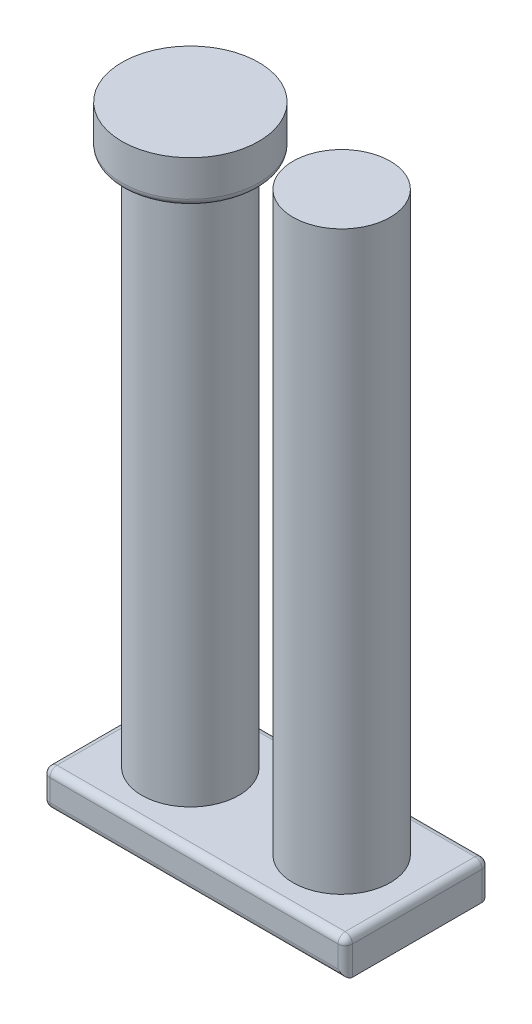
ISO-10303-21;
HEADER;
FILE_DESCRIPTION(('STEP AP214'),'2;1');
FILE_NAME('part.step','',(''),(''),'','','');
FILE_SCHEMA(('AUTOMOTIVE_DESIGN { 1 0 10303 214 1 1 1 1 }'));
ENDSEC;
DATA;
#1=APPLICATION_CONTEXT('core data for automotive mechanical design processes');
#2=APPLICATION_PROTOCOL_DEFINITION('international standard','automotive_design',2000,#1);
#3=PRODUCT_CONTEXT('',#1,'mechanical');
#4=PRODUCT('Part','Part','',(#3));
#5=PRODUCT_RELATED_PRODUCT_CATEGORY('part','',(#4));
#6=PRODUCT_DEFINITION_FORMATION('','',#4);
#7=PRODUCT_DEFINITION_CONTEXT('part definition',#1,'design');
#8=PRODUCT_DEFINITION('design','',#6,#7);
#9=PRODUCT_DEFINITION_SHAPE('','',#8);
#10=(LENGTH_UNIT() NAMED_UNIT(*) SI_UNIT(.MILLI.,.METRE.));
#11=(NAMED_UNIT(*) PLANE_ANGLE_UNIT() SI_UNIT($,.RADIAN.));
#12=(NAMED_UNIT(*) SI_UNIT($,.STERADIAN.) SOLID_ANGLE_UNIT());
#13=UNCERTAINTY_MEASURE_WITH_UNIT(LENGTH_MEASURE(1.E-05),#10,'distance_accuracy_value','');
#14=(GEOMETRIC_REPRESENTATION_CONTEXT(3) GLOBAL_UNCERTAINTY_ASSIGNED_CONTEXT((#13)) GLOBAL_UNIT_ASSIGNED_CONTEXT((#10,
#11,#12)) REPRESENTATION_CONTEXT('',''));
#15=CARTESIAN_POINT('',(0.,0.,0.));
#16=DIRECTION('',(0.,0.,1.));
#17=DIRECTION('',(1.,0.,0.));
#18=AXIS2_PLACEMENT_3D('',#15,#16,#17);
#19=CARTESIAN_POINT('',(-10.5,85.,0.));
#20=DIRECTION('',(0.,-1.,0.));
#21=DIRECTION('',(0.,0.,-1.));
#22=AXIS2_PLACEMENT_3D('',#19,#20,#21);
#23=CYLINDRICAL_SURFACE('',#22,6.75);
#24=CARTESIAN_POINT('',(-10.5,78.,0.));
#25=DIRECTION('',(0.,1.,0.));
#26=DIRECTION('',(0.,0.,1.));
#27=AXIS2_PLACEMENT_3D('',#24,#25,#26);
#28=CIRCLE('',#27,6.75);
#29=CARTESIAN_POINT('',(-10.5,78.,6.75));
#30=VERTEX_POINT('',#29);
#31=EDGE_CURVE('E11',#30,#30,#28,.F.);
#32=ORIENTED_EDGE('',*,*,#31,.T.);
#33=EDGE_LOOP('',(#32));
#34=FACE_BOUND('',#33,.T.);
#35=CARTESIAN_POINT('',(-10.5,5.,0.));
#36=DIRECTION('',(0.,1.,0.));
#37=DIRECTION('',(0.,0.,1.));
#38=AXIS2_PLACEMENT_3D('',#35,#36,#37);
#39=CIRCLE('',#38,6.75);
#40=CARTESIAN_POINT('',(-10.5,5.,6.75));
#41=VERTEX_POINT('',#40);
#42=EDGE_CURVE('E222',#41,#41,#39,.F.);
#43=ORIENTED_EDGE('',*,*,#42,.F.);
#44=EDGE_LOOP('',(#43));
#45=FACE_BOUND('',#44,.T.);
#46=ADVANCED_FACE('F39',(#34,#45),#23,.T.);
#47=CARTESIAN_POINT('',(21.,5.,0.));
#48=DIRECTION('',(1.,0.,0.));
#49=DIRECTION('',(0.,0.,-1.));
#50=AXIS2_PLACEMENT_3D('',#47,#48,#49);
#51=PLANE('',#50);
#52=DIRECTION('',(0.,0.,1.));
#53=VECTOR('',#52,1.);
#54=CARTESIAN_POINT('',(21.,0.,0.));
#55=LINE('',#54,#53);
#56=CARTESIAN_POINT('',(21.,0.,-9.));
#57=VERTEX_POINT('',#56);
#58=CARTESIAN_POINT('',(21.,0.,9.00000000000001));
#59=VERTEX_POINT('',#58);
#60=EDGE_CURVE('E146',#57,#59,#55,.T.);
#61=ORIENTED_EDGE('',*,*,#60,.F.);
#62=DIRECTION('',(0.,-1.,0.));
#63=VECTOR('',#62,1.);
#64=CARTESIAN_POINT('',(21.,5.,-9.));
#65=LINE('',#64,#63);
#66=CARTESIAN_POINT('',(21.,4.,-9.));
#67=VERTEX_POINT('',#66);
#68=EDGE_CURVE('E233',#57,#67,#65,.F.);
#69=ORIENTED_EDGE('',*,*,#68,.T.);
#70=DIRECTION('',(0.,0.,1.));
#71=VECTOR('',#70,1.);
#72=CARTESIAN_POINT('',(21.,4.,0.));
#73=LINE('',#72,#71);
#74=CARTESIAN_POINT('',(21.,4.,9.00000000000001));
#75=VERTEX_POINT('',#74);
#76=EDGE_CURVE('E229',#67,#75,#73,.T.);
#77=ORIENTED_EDGE('',*,*,#76,.T.);
#78=DIRECTION('',(0.,-1.,0.));
#79=VECTOR('',#78,1.);
#80=CARTESIAN_POINT('',(21.,0.,9.00000000000001));
#81=LINE('',#80,#79);
#82=EDGE_CURVE('E231',#75,#59,#81,.T.);
#83=ORIENTED_EDGE('',*,*,#82,.T.);
#84=EDGE_LOOP('',(#61,#69,#77,#83));
#85=FACE_BOUND('',#84,.T.);
#86=ADVANCED_FACE('F278',(#85),#51,.T.);
#87=CARTESIAN_POINT('',(0.,5.,-9.99999999999999));
#88=DIRECTION('',(0.,0.,-1.));
#89=DIRECTION('',(-1.,0.,0.));
#90=AXIS2_PLACEMENT_3D('',#87,#88,#89);
#91=PLANE('',#90);
#92=DIRECTION('',(1.,0.,0.));
#93=VECTOR('',#92,1.);
#94=CARTESIAN_POINT('',(0.,4.,-9.99999999999999));
#95=LINE('',#94,#93);
#96=CARTESIAN_POINT('',(-20.,4.,-9.99999999999999));
#97=VERTEX_POINT('',#96);
#98=CARTESIAN_POINT('',(20.,4.,-10.));
#99=VERTEX_POINT('',#98);
#100=EDGE_CURVE('E134',#97,#99,#95,.T.);
#101=ORIENTED_EDGE('',*,*,#100,.T.);
#102=DIRECTION('',(0.,-1.,0.));
#103=VECTOR('',#102,1.);
#104=CARTESIAN_POINT('',(20.,5.,-10.));
#105=LINE('',#104,#103);
#106=CARTESIAN_POINT('',(20.,1.,-10.));
#107=VERTEX_POINT('',#106);
#108=EDGE_CURVE('E130',#99,#107,#105,.T.);
#109=ORIENTED_EDGE('',*,*,#108,.T.);
#110=DIRECTION('',(1.,0.,0.));
#111=VECTOR('',#110,1.);
#112=CARTESIAN_POINT('',(-21.,1.,-9.99999999999999));
#113=LINE('',#112,#111);
#114=CARTESIAN_POINT('',(-20.,1.,-9.99999999999999));
#115=VERTEX_POINT('',#114);
#116=EDGE_CURVE('E124',#107,#115,#113,.F.);
#117=ORIENTED_EDGE('',*,*,#116,.T.);
#118=DIRECTION('',(0.,-1.,0.));
#119=VECTOR('',#118,1.);
#120=CARTESIAN_POINT('',(-20.,5.,-9.99999999999999));
#121=LINE('',#120,#119);
#122=EDGE_CURVE('E127',#115,#97,#121,.F.);
#123=ORIENTED_EDGE('',*,*,#122,.T.);
#124=EDGE_LOOP('',(#101,#109,#117,#123));
#125=FACE_BOUND('',#124,.T.);
#126=ADVANCED_FACE('F126',(#125),#91,.T.);
#127=CARTESIAN_POINT('',(-21.,5.,0.));
#128=DIRECTION('',(1.,0.,0.));
#129=DIRECTION('',(0.,0.,-1.));
#130=AXIS2_PLACEMENT_3D('',#127,#128,#129);
#131=PLANE('',#130);
#132=DIRECTION('',(0.,0.,1.));
#133=VECTOR('',#132,1.);
#134=CARTESIAN_POINT('',(-21.,4.,-9.99999999999999));
#135=LINE('',#134,#133);
#136=CARTESIAN_POINT('',(-21.,4.,9.00000000000001));
#137=VERTEX_POINT('',#136);
#138=CARTESIAN_POINT('',(-21.,4.,-8.99999999999999));
#139=VERTEX_POINT('',#138);
#140=EDGE_CURVE('E56',#137,#139,#135,.F.);
#141=ORIENTED_EDGE('',*,*,#140,.T.);
#142=DIRECTION('',(0.,-1.,0.));
#143=VECTOR('',#142,1.);
#144=CARTESIAN_POINT('',(-21.,0.,-8.99999999999999));
#145=LINE('',#144,#143);
#146=CARTESIAN_POINT('',(-21.,1.,-8.99999999999999));
#147=VERTEX_POINT('',#146);
#148=EDGE_CURVE('E263',#139,#147,#145,.T.);
#149=ORIENTED_EDGE('',*,*,#148,.T.);
#150=DIRECTION('',(0.,0.,1.));
#151=VECTOR('',#150,1.);
#152=CARTESIAN_POINT('',(-21.,1.,0.));
#153=LINE('',#152,#151);
#154=CARTESIAN_POINT('',(-21.,1.,9.00000000000001));
#155=VERTEX_POINT('',#154);
#156=EDGE_CURVE('E259',#147,#155,#153,.T.);
#157=ORIENTED_EDGE('',*,*,#156,.T.);
#158=DIRECTION('',(0.,-1.,0.));
#159=VECTOR('',#158,1.);
#160=CARTESIAN_POINT('',(-21.,5.,9.00000000000001));
#161=LINE('',#160,#159);
#162=EDGE_CURVE('E61',#155,#137,#161,.F.);
#163=ORIENTED_EDGE('',*,*,#162,.T.);
#164=EDGE_LOOP('',(#141,#149,#157,#163));
#165=FACE_BOUND('',#164,.T.);
#166=ADVANCED_FACE('F294',(#165),#131,.F.);
#167=CARTESIAN_POINT('',(0.,5.,10.));
#168=DIRECTION('',(0.,0.,-1.));
#169=DIRECTION('',(-1.,0.,0.));
#170=AXIS2_PLACEMENT_3D('',#167,#168,#169);
#171=PLANE('',#170);
#172=DIRECTION('',(1.,0.,0.));
#173=VECTOR('',#172,1.);
#174=CARTESIAN_POINT('',(0.,1.,10.));
#175=LINE('',#174,#173);
#176=CARTESIAN_POINT('',(-20.,1.,10.));
#177=VERTEX_POINT('',#176);
#178=CARTESIAN_POINT('',(20.,1.,10.));
#179=VERTEX_POINT('',#178);
#180=EDGE_CURVE('E245',#177,#179,#175,.T.);
#181=ORIENTED_EDGE('',*,*,#180,.T.);
#182=DIRECTION('',(0.,-1.,0.));
#183=VECTOR('',#182,1.);
#184=CARTESIAN_POINT('',(20.,5.,10.));
#185=LINE('',#184,#183);
#186=CARTESIAN_POINT('',(20.,4.,10.));
#187=VERTEX_POINT('',#186);
#188=EDGE_CURVE('E247',#179,#187,#185,.F.);
#189=ORIENTED_EDGE('',*,*,#188,.T.);
#190=DIRECTION('',(1.,0.,0.));
#191=VECTOR('',#190,1.);
#192=CARTESIAN_POINT('',(-21.,4.,10.));
#193=LINE('',#192,#191);
#194=CARTESIAN_POINT('',(-20.,4.,10.));
#195=VERTEX_POINT('',#194);
#196=EDGE_CURVE('E243',#187,#195,#193,.F.);
#197=ORIENTED_EDGE('',*,*,#196,.T.);
#198=DIRECTION('',(0.,-1.,0.));
#199=VECTOR('',#198,1.);
#200=CARTESIAN_POINT('',(-20.,5.,10.));
#201=LINE('',#200,#199);
#202=EDGE_CURVE('E241',#195,#177,#201,.T.);
#203=ORIENTED_EDGE('',*,*,#202,.T.);
#204=EDGE_LOOP('',(#181,#189,#197,#203));
#205=FACE_BOUND('',#204,.T.);
#206=ADVANCED_FACE('F296',(#205),#171,.F.);
#207=CARTESIAN_POINT('',(0.,5.,0.));
#208=DIRECTION('',(0.,1.,0.));
#209=DIRECTION('',(0.,0.,1.));
#210=AXIS2_PLACEMENT_3D('',#207,#208,#209);
#211=PLANE('',#210);
#212=DIRECTION('',(1.,0.,0.));
#213=VECTOR('',#212,1.);
#214=CARTESIAN_POINT('',(21.,5.,9.00000000000001));
#215=LINE('',#214,#213);
#216=CARTESIAN_POINT('',(-20.,5.,9.00000000000001));
#217=VERTEX_POINT('',#216);
#218=CARTESIAN_POINT('',(20.,5.,9.00000000000001));
#219=VERTEX_POINT('',#218);
#220=EDGE_CURVE('E254',#217,#219,#215,.T.);
#221=ORIENTED_EDGE('',*,*,#220,.T.);
#222=DIRECTION('',(0.,0.,1.));
#223=VECTOR('',#222,1.);
#224=CARTESIAN_POINT('',(20.,5.,0.));
#225=LINE('',#224,#223);
#226=CARTESIAN_POINT('',(20.,5.,-9.));
#227=VERTEX_POINT('',#226);
#228=EDGE_CURVE('E257',#219,#227,#225,.F.);
#229=ORIENTED_EDGE('',*,*,#228,.T.);
#230=DIRECTION('',(1.,0.,0.));
#231=VECTOR('',#230,1.);
#232=CARTESIAN_POINT('',(0.,5.,-8.99999999999999));
#233=LINE('',#232,#231);
#234=CARTESIAN_POINT('',(-20.,5.,-8.99999999999999));
#235=VERTEX_POINT('',#234);
#236=EDGE_CURVE('E252',#227,#235,#233,.F.);
#237=ORIENTED_EDGE('',*,*,#236,.T.);
#238=DIRECTION('',(0.,0.,1.));
#239=VECTOR('',#238,1.);
#240=CARTESIAN_POINT('',(-20.,5.,10.));
#241=LINE('',#240,#239);
#242=EDGE_CURVE('E250',#235,#217,#241,.T.);
#243=ORIENTED_EDGE('',*,*,#242,.T.);
#244=EDGE_LOOP('',(#221,#229,#237,#243));
#245=FACE_BOUND('',#244,.T.);
#246=CARTESIAN_POINT('',(10.5,5.,0.));
#247=DIRECTION('',(0.,1.,0.));
#248=DIRECTION('',(0.,0.,1.));
#249=AXIS2_PLACEMENT_3D('',#246,#247,#248);
#250=CIRCLE('',#249,6.75);
#251=CARTESIAN_POINT('',(10.5,5.,6.75));
#252=VERTEX_POINT('',#251);
#253=EDGE_CURVE('E217',#252,#252,#250,.F.);
#254=ORIENTED_EDGE('',*,*,#253,.T.);
#255=EDGE_LOOP('',(#254));
#256=FACE_BOUND('',#255,.T.);
#257=ORIENTED_EDGE('',*,*,#42,.T.);
#258=EDGE_LOOP('',(#257));
#259=FACE_BOUND('',#258,.T.);
#260=ADVANCED_FACE('F302',(#245,#256,#259),#211,.T.);
#261=CARTESIAN_POINT('',(0.,0.,0.));
#262=DIRECTION('',(0.,1.,0.));
#263=DIRECTION('',(0.,0.,1.));
#264=AXIS2_PLACEMENT_3D('',#261,#262,#263);
#265=PLANE('',#264);
#266=DIRECTION('',(0.,0.,1.));
#267=VECTOR('',#266,1.);
#268=CARTESIAN_POINT('',(-20.,0.,0.));
#269=LINE('',#268,#267);
#270=CARTESIAN_POINT('',(-20.,0.,9.00000000000001));
#271=VERTEX_POINT('',#270);
#272=CARTESIAN_POINT('',(-20.,0.,-8.99999999999999));
#273=VERTEX_POINT('',#272);
#274=EDGE_CURVE('E236',#271,#273,#269,.F.);
#275=ORIENTED_EDGE('',*,*,#274,.T.);
#276=DIRECTION('',(1.,0.,0.));
#277=VECTOR('',#276,1.);
#278=CARTESIAN_POINT('',(21.,0.,-9.));
#279=LINE('',#278,#277);
#280=EDGE_CURVE('E158',#273,#57,#279,.T.);
#281=ORIENTED_EDGE('',*,*,#280,.T.);
#282=ORIENTED_EDGE('',*,*,#60,.T.);
#283=DIRECTION('',(1.,0.,0.));
#284=VECTOR('',#283,1.);
#285=CARTESIAN_POINT('',(0.,0.,9.00000000000001));
#286=LINE('',#285,#284);
#287=EDGE_CURVE('E238',#59,#271,#286,.F.);
#288=ORIENTED_EDGE('',*,*,#287,.T.);
#289=EDGE_LOOP('',(#275,#281,#282,#288));
#290=FACE_BOUND('',#289,.T.);
#291=ADVANCED_FACE('F282',(#290),#265,.F.);
#292=CARTESIAN_POINT('',(10.5,85.,0.));
#293=DIRECTION('',(0.,-1.,0.));
#294=DIRECTION('',(0.,0.,-1.));
#295=AXIS2_PLACEMENT_3D('',#292,#293,#294);
#296=CYLINDRICAL_SURFACE('',#295,6.75);
#297=ORIENTED_EDGE('',*,*,#253,.F.);
#298=EDGE_LOOP('',(#297));
#299=FACE_BOUND('',#298,.T.);
#300=CARTESIAN_POINT('',(10.5,85.,0.));
#301=DIRECTION('',(0.,1.,0.));
#302=DIRECTION('',(0.,0.,1.));
#303=AXIS2_PLACEMENT_3D('',#300,#301,#302);
#304=CIRCLE('',#303,6.75);
#305=CARTESIAN_POINT('',(10.5,85.,6.75));
#306=VERTEX_POINT('',#305);
#307=EDGE_CURVE('E212',#306,#306,#304,.T.);
#308=ORIENTED_EDGE('',*,*,#307,.F.);
#309=EDGE_LOOP('',(#308));
#310=FACE_BOUND('',#309,.T.);
#311=ADVANCED_FACE('F323',(#299,#310),#296,.T.);
#312=CARTESIAN_POINT('',(0.,85.,0.));
#313=DIRECTION('',(0.,1.,0.));
#314=DIRECTION('',(0.,0.,1.));
#315=AXIS2_PLACEMENT_3D('',#312,#313,#314);
#316=PLANE('',#315);
#317=ORIENTED_EDGE('',*,*,#307,.T.);
#318=EDGE_LOOP('',(#317));
#319=FACE_BOUND('',#318,.T.);
#320=ADVANCED_FACE('F328',(#319),#316,.T.);
#321=CARTESIAN_POINT('',(-10.5,79.,0.));
#322=DIRECTION('',(0.,1.,0.));
#323=DIRECTION('',(0.,0.,1.));
#324=AXIS2_PLACEMENT_3D('',#321,#322,#323);
#325=CYLINDRICAL_SURFACE('',#324,9.5);
#326=CARTESIAN_POINT('',(-10.5,80.,0.));
#327=DIRECTION('',(0.,1.,0.));
#328=DIRECTION('',(0.,0.,1.));
#329=AXIS2_PLACEMENT_3D('',#326,#327,#328);
#330=CIRCLE('',#329,9.5);
#331=CARTESIAN_POINT('',(-10.5,80.,9.5));
#332=VERTEX_POINT('',#331);
#333=EDGE_CURVE('E265',#332,#332,#330,.T.);
#334=ORIENTED_EDGE('',*,*,#333,.T.);
#335=EDGE_LOOP('',(#334));
#336=FACE_BOUND('',#335,.T.);
#337=CARTESIAN_POINT('',(-10.5,85.,0.));
#338=DIRECTION('',(0.,1.,0.));
#339=DIRECTION('',(0.,0.,1.));
#340=AXIS2_PLACEMENT_3D('',#337,#338,#339);
#341=CIRCLE('',#340,9.5);
#342=CARTESIAN_POINT('',(-10.5,85.,9.5));
#343=VERTEX_POINT('',#342);
#344=EDGE_CURVE('E206',#343,#343,#341,.T.);
#345=ORIENTED_EDGE('',*,*,#344,.F.);
#346=EDGE_LOOP('',(#345));
#347=FACE_BOUND('',#346,.T.);
#348=ADVANCED_FACE('F333',(#336,#347),#325,.T.);
#349=CARTESIAN_POINT('',(-10.5,79.,0.));
#350=DIRECTION('',(0.,1.,0.));
#351=DIRECTION('',(0.,0.,1.));
#352=AXIS2_PLACEMENT_3D('',#349,#350,#351);
#353=PLANE('',#352);
#354=CARTESIAN_POINT('',(-10.5,79.,0.));
#355=DIRECTION('',(0.,1.,0.));
#356=DIRECTION('',(0.,0.,1.));
#357=AXIS2_PLACEMENT_3D('',#354,#355,#356);
#358=CIRCLE('',#357,8.5);
#359=CARTESIAN_POINT('',(-10.5,79.,8.5));
#360=VERTEX_POINT('',#359);
#361=EDGE_CURVE('E48',#360,#360,#358,.F.);
#362=ORIENTED_EDGE('',*,*,#361,.T.);
#363=EDGE_LOOP('',(#362));
#364=FACE_BOUND('',#363,.T.);
#365=CARTESIAN_POINT('',(-10.5,79.,0.));
#366=DIRECTION('',(0.,1.,0.));
#367=DIRECTION('',(0.,0.,1.));
#368=AXIS2_PLACEMENT_3D('',#365,#366,#367);
#369=CIRCLE('',#368,7.75);
#370=CARTESIAN_POINT('',(-10.5,79.,7.75));
#371=VERTEX_POINT('',#370);
#372=EDGE_CURVE('E268',#371,#371,#369,.T.);
#373=ORIENTED_EDGE('',*,*,#372,.T.);
#374=EDGE_LOOP('',(#373));
#375=FACE_BOUND('',#374,.T.);
#376=ADVANCED_FACE('F340',(#364,#375),#353,.F.);
#377=CARTESIAN_POINT('',(0.,85.,0.));
#378=DIRECTION('',(0.,1.,0.));
#379=DIRECTION('',(0.,0.,1.));
#380=AXIS2_PLACEMENT_3D('',#377,#378,#379);
#381=PLANE('',#380);
#382=ORIENTED_EDGE('',*,*,#344,.T.);
#383=EDGE_LOOP('',(#382));
#384=FACE_BOUND('',#383,.T.);
#385=ADVANCED_FACE('F317',(#384),#381,.T.);
#386=CARTESIAN_POINT('',(-20.,4.,9.00000000000001));
#387=DIRECTION('',(0.,0.,1.));
#388=DIRECTION('',(1.,0.,0.));
#389=AXIS2_PLACEMENT_3D('',#386,#387,#388);
#390=SPHERICAL_SURFACE('',#389,1.);
#391=CARTESIAN_POINT('',(-20.,4.,9.00000000000001));
#392=DIRECTION('',(0.,0.,1.));
#393=DIRECTION('',(1.,0.,0.));
#394=AXIS2_PLACEMENT_3D('',#391,#392,#393);
#395=CIRCLE('',#394,1.);
#396=EDGE_CURVE('E195',#137,#217,#395,.F.);
#397=ORIENTED_EDGE('',*,*,#396,.F.);
#398=CARTESIAN_POINT('',(-20.,4.,9.00000000000001));
#399=DIRECTION('',(0.,1.,0.));
#400=DIRECTION('',(0.,0.,1.));
#401=AXIS2_PLACEMENT_3D('',#398,#399,#400);
#402=CIRCLE('',#401,1.);
#403=EDGE_CURVE('E43',#195,#137,#402,.F.);
#404=ORIENTED_EDGE('',*,*,#403,.F.);
#405=CARTESIAN_POINT('',(-20.,4.,9.00000000000001));
#406=DIRECTION('',(-1.,0.,0.));
#407=DIRECTION('',(0.,0.,1.));
#408=AXIS2_PLACEMENT_3D('',#405,#406,#407);
#409=CIRCLE('',#408,1.);
#410=EDGE_CURVE('E198',#217,#195,#409,.F.);
#411=ORIENTED_EDGE('',*,*,#410,.F.);
#412=EDGE_LOOP('',(#397,#404,#411));
#413=FACE_BOUND('',#412,.T.);
#414=ADVANCED_FACE('F347',(#413),#390,.T.);
#415=CARTESIAN_POINT('',(-20.,5.,9.00000000000001));
#416=DIRECTION('',(0.,-1.,0.));
#417=DIRECTION('',(0.,0.,-1.));
#418=AXIS2_PLACEMENT_3D('',#415,#416,#417);
#419=CYLINDRICAL_SURFACE('',#418,1.);
#420=ORIENTED_EDGE('',*,*,#403,.T.);
#421=ORIENTED_EDGE('',*,*,#162,.F.);
#422=CARTESIAN_POINT('',(-20.,1.,9.00000000000001));
#423=DIRECTION('',(0.,-1.,0.));
#424=DIRECTION('',(0.,0.,-1.));
#425=AXIS2_PLACEMENT_3D('',#422,#423,#424);
#426=CIRCLE('',#425,1.);
#427=EDGE_CURVE('E192',#177,#155,#426,.T.);
#428=ORIENTED_EDGE('',*,*,#427,.F.);
#429=ORIENTED_EDGE('',*,*,#202,.F.);
#430=EDGE_LOOP('',(#420,#421,#428,#429));
#431=FACE_BOUND('',#430,.T.);
#432=ADVANCED_FACE('F367',(#431),#419,.T.);
#433=CARTESIAN_POINT('',(0.,1.,9.00000000000001));
#434=DIRECTION('',(1.,0.,0.));
#435=DIRECTION('',(0.,0.,-1.));
#436=AXIS2_PLACEMENT_3D('',#433,#434,#435);
#437=CYLINDRICAL_SURFACE('',#436,1.);
#438=CARTESIAN_POINT('',(-20.,1.,9.00000000000001));
#439=DIRECTION('',(-1.,0.,0.));
#440=DIRECTION('',(0.,0.,1.));
#441=AXIS2_PLACEMENT_3D('',#438,#439,#440);
#442=CIRCLE('',#441,1.);
#443=EDGE_CURVE('E189',#271,#177,#442,.T.);
#444=ORIENTED_EDGE('',*,*,#443,.F.);
#445=ORIENTED_EDGE('',*,*,#287,.F.);
#446=CARTESIAN_POINT('',(20.,1.,9.00000000000001));
#447=DIRECTION('',(0.707106781186547,0.707106781186547,0.));
#448=DIRECTION('',(0.707106781186547,-0.707106781186547,0.));
#449=AXIS2_PLACEMENT_3D('',#446,#447,#448);
#450=ELLIPSE('',#449,1.41421356237309,1.);
#451=EDGE_CURVE('E200',#179,#59,#450,.T.);
#452=ORIENTED_EDGE('',*,*,#451,.F.);
#453=ORIENTED_EDGE('',*,*,#180,.F.);
#454=EDGE_LOOP('',(#444,#445,#452,#453));
#455=FACE_BOUND('',#454,.T.);
#456=ADVANCED_FACE('F285',(#455),#437,.T.);
#457=CARTESIAN_POINT('',(20.,5.,9.00000000000001));
#458=DIRECTION('',(0.,1.,0.));
#459=DIRECTION('',(0.,0.,1.));
#460=AXIS2_PLACEMENT_3D('',#457,#458,#459);
#461=CYLINDRICAL_SURFACE('',#460,1.);
#462=ORIENTED_EDGE('',*,*,#451,.T.);
#463=ORIENTED_EDGE('',*,*,#82,.F.);
#464=CARTESIAN_POINT('',(20.,4.,9.00000000000001));
#465=DIRECTION('',(0.,1.,0.));
#466=DIRECTION('',(0.,0.,1.));
#467=AXIS2_PLACEMENT_3D('',#464,#465,#466);
#468=CIRCLE('',#467,1.);
#469=EDGE_CURVE('E186',#187,#75,#468,.T.);
#470=ORIENTED_EDGE('',*,*,#469,.F.);
#471=ORIENTED_EDGE('',*,*,#188,.F.);
#472=EDGE_LOOP('',(#462,#463,#470,#471));
#473=FACE_BOUND('',#472,.T.);
#474=ADVANCED_FACE('F373',(#473),#461,.T.);
#475=CARTESIAN_POINT('',(0.,4.,9.00000000000001));
#476=DIRECTION('',(-1.,0.,0.));
#477=DIRECTION('',(0.,0.,1.));
#478=AXIS2_PLACEMENT_3D('',#475,#476,#477);
#479=CYLINDRICAL_SURFACE('',#478,1.);
#480=ORIENTED_EDGE('',*,*,#410,.T.);
#481=ORIENTED_EDGE('',*,*,#196,.F.);
#482=CARTESIAN_POINT('',(20.,4.,9.00000000000001));
#483=DIRECTION('',(1.,0.,0.));
#484=DIRECTION('',(0.,0.,-1.));
#485=AXIS2_PLACEMENT_3D('',#482,#483,#484);
#486=CIRCLE('',#485,1.);
#487=EDGE_CURVE('E184',#219,#187,#486,.T.);
#488=ORIENTED_EDGE('',*,*,#487,.F.);
#489=ORIENTED_EDGE('',*,*,#220,.F.);
#490=EDGE_LOOP('',(#480,#481,#488,#489));
#491=FACE_BOUND('',#490,.T.);
#492=ADVANCED_FACE('F376',(#491),#479,.T.);
#493=CARTESIAN_POINT('',(-20.,4.,0.));
#494=DIRECTION('',(0.,0.,-1.));
#495=DIRECTION('',(-1.,0.,0.));
#496=AXIS2_PLACEMENT_3D('',#493,#494,#495);
#497=CYLINDRICAL_SURFACE('',#496,1.);
#498=ORIENTED_EDGE('',*,*,#396,.T.);
#499=ORIENTED_EDGE('',*,*,#242,.F.);
#500=CARTESIAN_POINT('',(-20.,4.,-8.99999999999999));
#501=DIRECTION('',(0.,0.,-1.));
#502=DIRECTION('',(0.,1.,0.));
#503=AXIS2_PLACEMENT_3D('',#500,#501,#502);
#504=CIRCLE('',#503,1.);
#505=EDGE_CURVE('E181',#139,#235,#504,.T.);
#506=ORIENTED_EDGE('',*,*,#505,.F.);
#507=ORIENTED_EDGE('',*,*,#140,.F.);
#508=EDGE_LOOP('',(#498,#499,#506,#507));
#509=FACE_BOUND('',#508,.T.);
#510=ADVANCED_FACE('F379',(#509),#497,.T.);
#511=CARTESIAN_POINT('',(-20.,1.,9.00000000000001));
#512=DIRECTION('',(0.,0.,1.));
#513=DIRECTION('',(1.,0.,0.));
#514=AXIS2_PLACEMENT_3D('',#511,#512,#513);
#515=SPHERICAL_SURFACE('',#514,1.);
#516=ORIENTED_EDGE('',*,*,#443,.T.);
#517=ORIENTED_EDGE('',*,*,#427,.T.);
#518=CARTESIAN_POINT('',(-20.,1.,9.00000000000001));
#519=DIRECTION('',(0.,0.,1.));
#520=DIRECTION('',(1.,0.,0.));
#521=AXIS2_PLACEMENT_3D('',#518,#519,#520);
#522=CIRCLE('',#521,1.);
#523=EDGE_CURVE('E177',#271,#155,#522,.F.);
#524=ORIENTED_EDGE('',*,*,#523,.F.);
#525=EDGE_LOOP('',(#516,#517,#524));
#526=FACE_BOUND('',#525,.T.);
#527=ADVANCED_FACE('F291',(#526),#515,.T.);
#528=CARTESIAN_POINT('',(20.,4.,9.00000000000001));
#529=DIRECTION('',(0.,0.,1.));
#530=DIRECTION('',(1.,0.,0.));
#531=AXIS2_PLACEMENT_3D('',#528,#529,#530);
#532=SPHERICAL_SURFACE('',#531,1.);
#533=ORIENTED_EDGE('',*,*,#487,.T.);
#534=ORIENTED_EDGE('',*,*,#469,.T.);
#535=CARTESIAN_POINT('',(20.,4.,9.00000000000001));
#536=DIRECTION('',(0.,0.,1.));
#537=DIRECTION('',(1.,0.,0.));
#538=AXIS2_PLACEMENT_3D('',#535,#536,#537);
#539=CIRCLE('',#538,1.);
#540=EDGE_CURVE('E174',#219,#75,#539,.F.);
#541=ORIENTED_EDGE('',*,*,#540,.F.);
#542=EDGE_LOOP('',(#533,#534,#541));
#543=FACE_BOUND('',#542,.T.);
#544=ADVANCED_FACE('F386',(#543),#532,.T.);
#545=CARTESIAN_POINT('',(-20.,4.,-8.99999999999999));
#546=DIRECTION('',(-1.,0.,0.));
#547=DIRECTION('',(0.,0.,1.));
#548=AXIS2_PLACEMENT_3D('',#545,#546,#547);
#549=SPHERICAL_SURFACE('',#548,1.);
#550=CARTESIAN_POINT('',(-20.,4.,-8.99999999999999));
#551=DIRECTION('',(-1.,0.,0.));
#552=DIRECTION('',(0.,0.,1.));
#553=AXIS2_PLACEMENT_3D('',#550,#551,#552);
#554=CIRCLE('',#553,1.);
#555=EDGE_CURVE('E155',#97,#235,#554,.F.);
#556=ORIENTED_EDGE('',*,*,#555,.F.);
#557=CARTESIAN_POINT('',(-20.,4.,-8.99999999999999));
#558=DIRECTION('',(0.,1.,0.));
#559=DIRECTION('',(0.,0.,1.));
#560=AXIS2_PLACEMENT_3D('',#557,#558,#559);
#561=CIRCLE('',#560,1.);
#562=EDGE_CURVE('E144',#139,#97,#561,.F.);
#563=ORIENTED_EDGE('',*,*,#562,.F.);
#564=ORIENTED_EDGE('',*,*,#505,.T.);
#565=EDGE_LOOP('',(#556,#563,#564));
#566=FACE_BOUND('',#565,.T.);
#567=ADVANCED_FACE('F389',(#566),#549,.T.);
#568=CARTESIAN_POINT('',(-20.,5.,-8.99999999999999));
#569=DIRECTION('',(0.,1.,0.));
#570=DIRECTION('',(0.,0.,1.));
#571=AXIS2_PLACEMENT_3D('',#568,#569,#570);
#572=CYLINDRICAL_SURFACE('',#571,1.);
#573=ORIENTED_EDGE('',*,*,#562,.T.);
#574=ORIENTED_EDGE('',*,*,#122,.F.);
#575=CARTESIAN_POINT('',(-20.,1.,-8.99999999999999));
#576=DIRECTION('',(0.,-1.,0.));
#577=DIRECTION('',(0.,0.,-1.));
#578=AXIS2_PLACEMENT_3D('',#575,#576,#577);
#579=CIRCLE('',#578,1.);
#580=EDGE_CURVE('E141',#147,#115,#579,.T.);
#581=ORIENTED_EDGE('',*,*,#580,.F.);
#582=ORIENTED_EDGE('',*,*,#148,.F.);
#583=EDGE_LOOP('',(#573,#574,#581,#582));
#584=FACE_BOUND('',#583,.T.);
#585=ADVANCED_FACE('F139',(#584),#572,.T.);
#586=CARTESIAN_POINT('',(-20.,1.,0.));
#587=DIRECTION('',(0.,0.,1.));
#588=DIRECTION('',(1.,0.,0.));
#589=AXIS2_PLACEMENT_3D('',#586,#587,#588);
#590=CYLINDRICAL_SURFACE('',#589,1.);
#591=ORIENTED_EDGE('',*,*,#523,.T.);
#592=ORIENTED_EDGE('',*,*,#156,.F.);
#593=CARTESIAN_POINT('',(-20.,1.,-8.99999999999999));
#594=DIRECTION('',(0.,0.,-1.));
#595=DIRECTION('',(-1.,0.,0.));
#596=AXIS2_PLACEMENT_3D('',#593,#594,#595);
#597=CIRCLE('',#596,1.);
#598=EDGE_CURVE('E154',#273,#147,#597,.T.);
#599=ORIENTED_EDGE('',*,*,#598,.F.);
#600=ORIENTED_EDGE('',*,*,#274,.F.);
#601=EDGE_LOOP('',(#591,#592,#599,#600));
#602=FACE_BOUND('',#601,.T.);
#603=ADVANCED_FACE('F293',(#602),#590,.T.);
#604=CARTESIAN_POINT('',(20.,4.,0.));
#605=DIRECTION('',(0.,0.,1.));
#606=DIRECTION('',(1.,0.,0.));
#607=AXIS2_PLACEMENT_3D('',#604,#605,#606);
#608=CYLINDRICAL_SURFACE('',#607,1.);
#609=ORIENTED_EDGE('',*,*,#540,.T.);
#610=ORIENTED_EDGE('',*,*,#76,.F.);
#611=CARTESIAN_POINT('',(20.,4.,-9.));
#612=DIRECTION('',(0.,0.,-1.));
#613=DIRECTION('',(-1.,0.,0.));
#614=AXIS2_PLACEMENT_3D('',#611,#612,#613);
#615=CIRCLE('',#614,1.);
#616=EDGE_CURVE('E163',#227,#67,#615,.T.);
#617=ORIENTED_EDGE('',*,*,#616,.F.);
#618=ORIENTED_EDGE('',*,*,#228,.F.);
#619=EDGE_LOOP('',(#609,#610,#617,#618));
#620=FACE_BOUND('',#619,.T.);
#621=ADVANCED_FACE('F398',(#620),#608,.T.);
#622=CARTESIAN_POINT('',(0.,4.,-8.99999999999999));
#623=DIRECTION('',(1.,0.,0.));
#624=DIRECTION('',(0.,0.,-1.));
#625=AXIS2_PLACEMENT_3D('',#622,#623,#624);
#626=CYLINDRICAL_SURFACE('',#625,1.);
#627=ORIENTED_EDGE('',*,*,#555,.T.);
#628=ORIENTED_EDGE('',*,*,#236,.F.);
#629=CARTESIAN_POINT('',(20.,4.,-9.));
#630=DIRECTION('',(1.,0.,0.));
#631=DIRECTION('',(0.,0.,-1.));
#632=AXIS2_PLACEMENT_3D('',#629,#630,#631);
#633=CIRCLE('',#632,1.);
#634=EDGE_CURVE('E159',#99,#227,#633,.T.);
#635=ORIENTED_EDGE('',*,*,#634,.F.);
#636=ORIENTED_EDGE('',*,*,#100,.F.);
#637=EDGE_LOOP('',(#627,#628,#635,#636));
#638=FACE_BOUND('',#637,.T.);
#639=ADVANCED_FACE('F401',(#638),#626,.T.);
#640=CARTESIAN_POINT('',(-20.,1.,-8.99999999999999));
#641=DIRECTION('',(-1.,0.,0.));
#642=DIRECTION('',(0.,0.,1.));
#643=AXIS2_PLACEMENT_3D('',#640,#641,#642);
#644=SPHERICAL_SURFACE('',#643,1.);
#645=ORIENTED_EDGE('',*,*,#598,.T.);
#646=ORIENTED_EDGE('',*,*,#580,.T.);
#647=CARTESIAN_POINT('',(-20.,1.,-8.99999999999999));
#648=DIRECTION('',(-1.,0.,0.));
#649=DIRECTION('',(0.,0.,1.));
#650=AXIS2_PLACEMENT_3D('',#647,#648,#649);
#651=CIRCLE('',#650,1.);
#652=EDGE_CURVE('E151',#273,#115,#651,.F.);
#653=ORIENTED_EDGE('',*,*,#652,.F.);
#654=EDGE_LOOP('',(#645,#646,#653));
#655=FACE_BOUND('',#654,.T.);
#656=ADVANCED_FACE('F150',(#655),#644,.T.);
#657=CARTESIAN_POINT('',(20.,4.,-9.));
#658=DIRECTION('',(0.,1.,0.));
#659=DIRECTION('',(0.,0.,1.));
#660=AXIS2_PLACEMENT_3D('',#657,#658,#659);
#661=SPHERICAL_SURFACE('',#660,1.);
#662=ORIENTED_EDGE('',*,*,#634,.T.);
#663=ORIENTED_EDGE('',*,*,#616,.T.);
#664=CARTESIAN_POINT('',(20.,4.,-9.));
#665=DIRECTION('',(0.,1.,0.));
#666=DIRECTION('',(0.,0.,1.));
#667=AXIS2_PLACEMENT_3D('',#664,#665,#666);
#668=CIRCLE('',#667,1.);
#669=EDGE_CURVE('E160',#99,#67,#668,.F.);
#670=ORIENTED_EDGE('',*,*,#669,.F.);
#671=EDGE_LOOP('',(#662,#663,#670));
#672=FACE_BOUND('',#671,.T.);
#673=ADVANCED_FACE('F408',(#672),#661,.T.);
#674=CARTESIAN_POINT('',(0.,1.,-8.99999999999999));
#675=DIRECTION('',(-1.,0.,0.));
#676=DIRECTION('',(0.,0.,1.));
#677=AXIS2_PLACEMENT_3D('',#674,#675,#676);
#678=CYLINDRICAL_SURFACE('',#677,1.);
#679=ORIENTED_EDGE('',*,*,#652,.T.);
#680=ORIENTED_EDGE('',*,*,#116,.F.);
#681=CARTESIAN_POINT('',(20.,1.,-9.));
#682=DIRECTION('',(-0.707106781186547,-0.707106781186547,0.));
#683=DIRECTION('',(-0.707106781186547,0.707106781186547,0.));
#684=AXIS2_PLACEMENT_3D('',#681,#682,#683);
#685=ELLIPSE('',#684,1.41421356237309,1.);
#686=EDGE_CURVE('E165',#57,#107,#685,.F.);
#687=ORIENTED_EDGE('',*,*,#686,.F.);
#688=ORIENTED_EDGE('',*,*,#280,.F.);
#689=EDGE_LOOP('',(#679,#680,#687,#688));
#690=FACE_BOUND('',#689,.T.);
#691=ADVANCED_FACE('F157',(#690),#678,.T.);
#692=CARTESIAN_POINT('',(20.,5.,-9.));
#693=DIRECTION('',(0.,-1.,0.));
#694=DIRECTION('',(0.,0.,-1.));
#695=AXIS2_PLACEMENT_3D('',#692,#693,#694);
#696=CYLINDRICAL_SURFACE('',#695,1.);
#697=ORIENTED_EDGE('',*,*,#669,.T.);
#698=ORIENTED_EDGE('',*,*,#68,.F.);
#699=ORIENTED_EDGE('',*,*,#686,.T.);
#700=ORIENTED_EDGE('',*,*,#108,.F.);
#701=EDGE_LOOP('',(#697,#698,#699,#700));
#702=FACE_BOUND('',#701,.T.);
#703=ADVANCED_FACE('F274',(#702),#696,.T.);
#704=CARTESIAN_POINT('',(-10.5,80.,0.));
#705=DIRECTION('',(0.,1.,0.));
#706=DIRECTION('',(0.,0.,1.));
#707=AXIS2_PLACEMENT_3D('',#704,#705,#706);
#708=TOROIDAL_SURFACE('',#707,8.5,1.);
#709=ORIENTED_EDGE('',*,*,#361,.F.);
#710=EDGE_LOOP('',(#709));
#711=FACE_BOUND('',#710,.T.);
#712=ORIENTED_EDGE('',*,*,#333,.F.);
#713=EDGE_LOOP('',(#712));
#714=FACE_BOUND('',#713,.T.);
#715=ADVANCED_FACE('F353',(#711,#714),#708,.T.);
#716=CARTESIAN_POINT('',(-10.5,78.,0.));
#717=DIRECTION('',(0.,1.,0.));
#718=DIRECTION('',(0.,0.,1.));
#719=AXIS2_PLACEMENT_3D('',#716,#717,#718);
#720=TOROIDAL_SURFACE('',#719,7.75,1.);
#721=ORIENTED_EDGE('',*,*,#31,.F.);
#722=EDGE_LOOP('',(#721));
#723=FACE_BOUND('',#722,.T.);
#724=ORIENTED_EDGE('',*,*,#372,.F.);
#725=EDGE_LOOP('',(#724));
#726=FACE_BOUND('',#725,.T.);
#727=ADVANCED_FACE('F41',(#723,#726),#720,.F.);
#728=CLOSED_SHELL('',(#46,#86,#126,#166,#206,#260,#291,#311,#320,#348,#376,#385,#414,#432,#456,
#474,#492,#510,#527,#544,#567,#585,#603,#621,#639,#656,#673,#691,#703,#715,#727));
#729=MANIFOLD_SOLID_BREP('B2',#728);
#730=ADVANCED_BREP_SHAPE_REPRESENTATION('',(#18,#729),#14);
#731=SHAPE_DEFINITION_REPRESENTATION(#9,#730);
ENDSEC;
END-ISO-10303-21;
